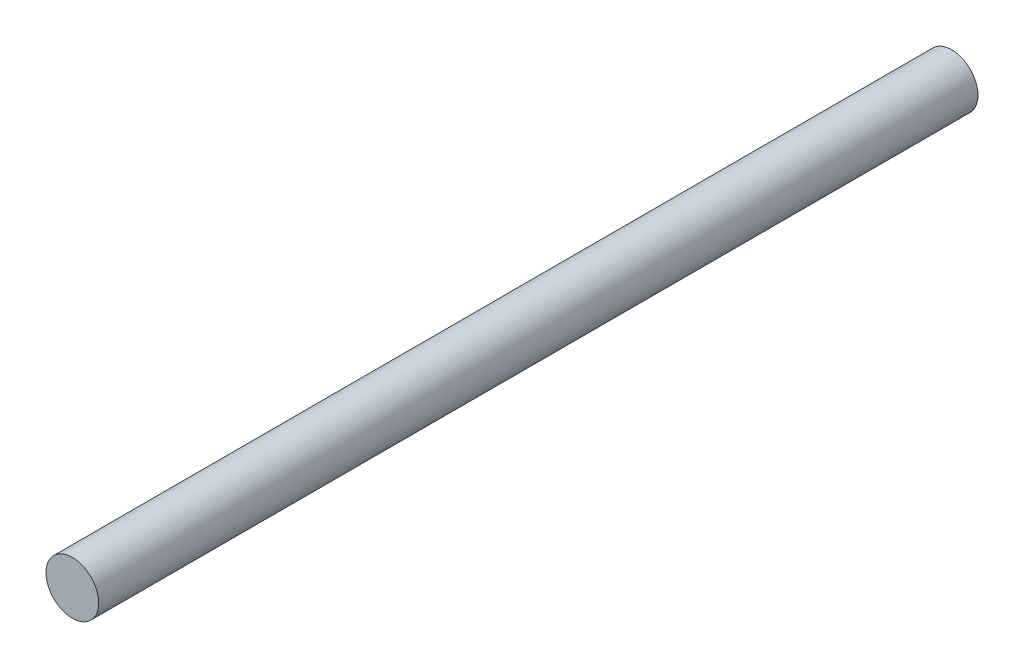
ISO-10303-21;
HEADER;
FILE_DESCRIPTION(('STEP AP214'),'2;1');
FILE_NAME('part.step','',(''),(''),'','','');
FILE_SCHEMA(('AUTOMOTIVE_DESIGN { 1 0 10303 214 1 1 1 1 }'));
ENDSEC;
DATA;
#1=APPLICATION_CONTEXT('core data for automotive mechanical design processes');
#2=APPLICATION_PROTOCOL_DEFINITION('international standard','automotive_design',2000,#1);
#3=PRODUCT_CONTEXT('',#1,'mechanical');
#4=PRODUCT('Part','Part','',(#3));
#5=PRODUCT_RELATED_PRODUCT_CATEGORY('part','',(#4));
#6=PRODUCT_DEFINITION_FORMATION('','',#4);
#7=PRODUCT_DEFINITION_CONTEXT('part definition',#1,'design');
#8=PRODUCT_DEFINITION('design','',#6,#7);
#9=PRODUCT_DEFINITION_SHAPE('','',#8);
#10=(LENGTH_UNIT() NAMED_UNIT(*) SI_UNIT(.MILLI.,.METRE.));
#11=(NAMED_UNIT(*) PLANE_ANGLE_UNIT() SI_UNIT($,.RADIAN.));
#12=(NAMED_UNIT(*) SI_UNIT($,.STERADIAN.) SOLID_ANGLE_UNIT());
#13=UNCERTAINTY_MEASURE_WITH_UNIT(LENGTH_MEASURE(1.E-05),#10,'distance_accuracy_value','');
#14=(GEOMETRIC_REPRESENTATION_CONTEXT(3) GLOBAL_UNCERTAINTY_ASSIGNED_CONTEXT((#13)) GLOBAL_UNIT_ASSIGNED_CONTEXT((#10,
#11,#12)) REPRESENTATION_CONTEXT('',''));
#15=CARTESIAN_POINT('',(0.,0.,0.));
#16=DIRECTION('',(0.,0.,1.));
#17=DIRECTION('',(1.,0.,0.));
#18=AXIS2_PLACEMENT_3D('',#15,#16,#17);
#19=CARTESIAN_POINT('',(0.,0.,250.));
#20=DIRECTION('',(0.,0.,-1.));
#21=DIRECTION('',(-1.,0.,0.));
#22=AXIS2_PLACEMENT_3D('',#19,#20,#21);
#23=CYLINDRICAL_SURFACE('',#22,7.5);
#24=CARTESIAN_POINT('',(0.,0.,250.));
#25=DIRECTION('',(0.,0.,1.));
#26=DIRECTION('',(1.,0.,0.));
#27=AXIS2_PLACEMENT_3D('',#24,#25,#26);
#28=CIRCLE('',#27,7.5);
#29=CARTESIAN_POINT('',(7.5,0.,250.));
#30=VERTEX_POINT('',#29);
#31=EDGE_CURVE('E10',#30,#30,#28,.T.);
#32=ORIENTED_EDGE('',*,*,#31,.F.);
#33=EDGE_LOOP('',(#32));
#34=FACE_BOUND('',#33,.T.);
#35=CARTESIAN_POINT('',(0.,0.,0.));
#36=DIRECTION('',(0.,0.,1.));
#37=DIRECTION('',(1.,0.,0.));
#38=AXIS2_PLACEMENT_3D('',#35,#36,#37);
#39=CIRCLE('',#38,7.5);
#40=CARTESIAN_POINT('',(7.5,0.,0.));
#41=VERTEX_POINT('',#40);
#42=EDGE_CURVE('E40',#41,#41,#39,.T.);
#43=ORIENTED_EDGE('',*,*,#42,.T.);
#44=EDGE_LOOP('',(#43));
#45=FACE_BOUND('',#44,.T.);
#46=ADVANCED_FACE('F37',(#34,#45),#23,.T.);
#47=CARTESIAN_POINT('',(0.,0.,250.));
#48=DIRECTION('',(0.,0.,1.));
#49=DIRECTION('',(1.,0.,0.));
#50=AXIS2_PLACEMENT_3D('',#47,#48,#49);
#51=PLANE('',#50);
#52=ORIENTED_EDGE('',*,*,#31,.T.);
#53=EDGE_LOOP('',(#52));
#54=FACE_BOUND('',#53,.T.);
#55=ADVANCED_FACE('F54',(#54),#51,.T.);
#56=CARTESIAN_POINT('',(0.,0.,0.));
#57=DIRECTION('',(0.,0.,1.));
#58=DIRECTION('',(1.,0.,0.));
#59=AXIS2_PLACEMENT_3D('',#56,#57,#58);
#60=PLANE('',#59);
#61=ORIENTED_EDGE('',*,*,#42,.F.);
#62=EDGE_LOOP('',(#61));
#63=FACE_BOUND('',#62,.T.);
#64=ADVANCED_FACE('F52',(#63),#60,.F.);
#65=CLOSED_SHELL('',(#46,#55,#64));
#66=MANIFOLD_SOLID_BREP('B2',#65);
#67=ADVANCED_BREP_SHAPE_REPRESENTATION('',(#18,#66),#14);
#68=SHAPE_DEFINITION_REPRESENTATION(#9,#67);
ENDSEC;
END-ISO-10303-21;
